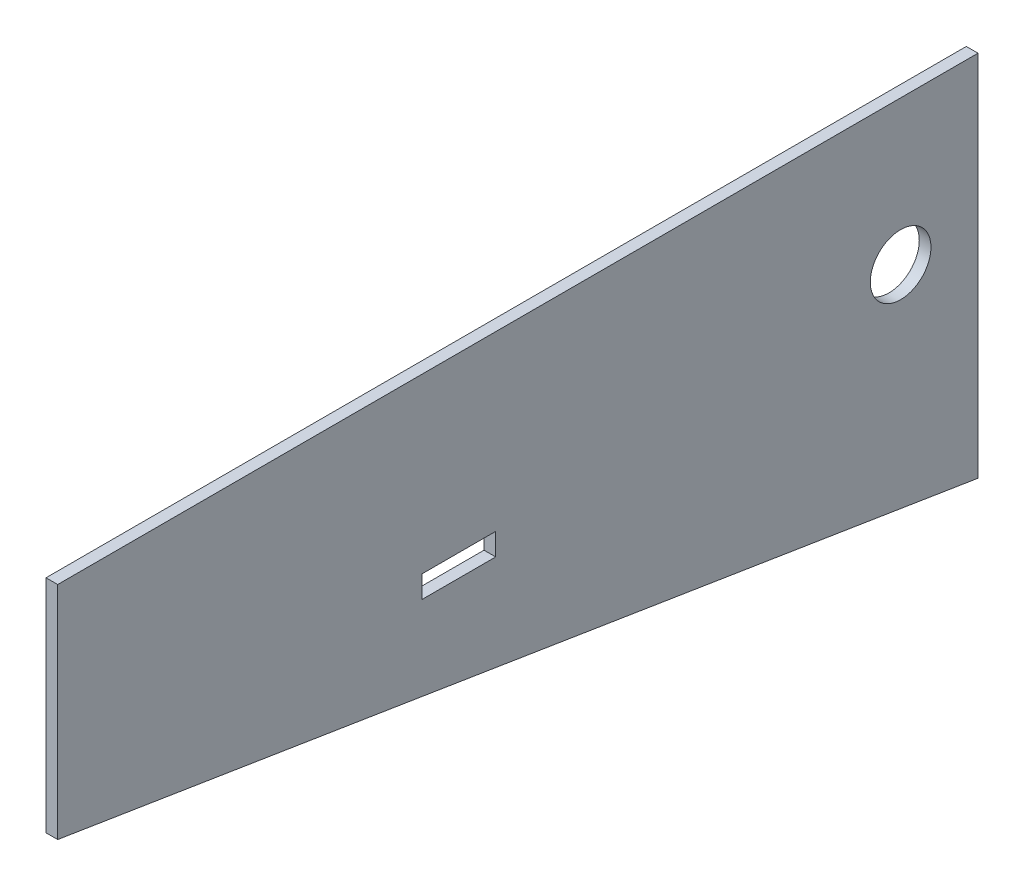
ISO-10303-21;
HEADER;
FILE_DESCRIPTION(('STEP AP214'),'2;1');
FILE_NAME('part.step','',(''),(''),'','','');
FILE_SCHEMA(('AUTOMOTIVE_DESIGN { 1 0 10303 214 1 1 1 1 }'));
ENDSEC;
DATA;
#1=APPLICATION_CONTEXT('core data for automotive mechanical design processes');
#2=APPLICATION_PROTOCOL_DEFINITION('international standard','automotive_design',2000,#1);
#3=PRODUCT_CONTEXT('',#1,'mechanical');
#4=PRODUCT('Part','Part','',(#3));
#5=PRODUCT_RELATED_PRODUCT_CATEGORY('part','',(#4));
#6=PRODUCT_DEFINITION_FORMATION('','',#4);
#7=PRODUCT_DEFINITION_CONTEXT('part definition',#1,'design');
#8=PRODUCT_DEFINITION('design','',#6,#7);
#9=PRODUCT_DEFINITION_SHAPE('','',#8);
#10=(LENGTH_UNIT() NAMED_UNIT(*) SI_UNIT(.MILLI.,.METRE.));
#11=(NAMED_UNIT(*) PLANE_ANGLE_UNIT() SI_UNIT($,.RADIAN.));
#12=(NAMED_UNIT(*) SI_UNIT($,.STERADIAN.) SOLID_ANGLE_UNIT());
#13=UNCERTAINTY_MEASURE_WITH_UNIT(LENGTH_MEASURE(1.E-05),#10,'distance_accuracy_value','');
#14=(GEOMETRIC_REPRESENTATION_CONTEXT(3) GLOBAL_UNCERTAINTY_ASSIGNED_CONTEXT((#13)) GLOBAL_UNIT_ASSIGNED_CONTEXT((#10,
#11,#12)) REPRESENTATION_CONTEXT('',''));
#15=CARTESIAN_POINT('',(0.,0.,0.));
#16=DIRECTION('',(0.,0.,1.));
#17=DIRECTION('',(1.,0.,0.));
#18=AXIS2_PLACEMENT_3D('',#15,#16,#17);
#19=CARTESIAN_POINT('',(1.5875,9.46131753405757,0.));
#20=DIRECTION('',(0.,0.,1.));
#21=DIRECTION('',(1.,0.,0.));
#22=AXIS2_PLACEMENT_3D('',#19,#20,#21);
#23=PLANE('',#22);
#24=DIRECTION('',(0.,1.,0.));
#25=VECTOR('',#24,1.);
#26=CARTESIAN_POINT('',(0.,9.46131753405757,0.));
#27=LINE('',#26,#25);
#28=CARTESIAN_POINT('',(0.,0.,0.));
#29=VERTEX_POINT('',#28);
#30=CARTESIAN_POINT('',(0.,30.,0.));
#31=VERTEX_POINT('',#30);
#32=EDGE_CURVE('E203',#29,#31,#27,.T.);
#33=ORIENTED_EDGE('',*,*,#32,.F.);
#34=DIRECTION('',(-1.,0.,0.));
#35=VECTOR('',#34,1.);
#36=CARTESIAN_POINT('',(1.5875,0.,0.));
#37=LINE('',#36,#35);
#38=CARTESIAN_POINT('',(1.5875,0.,0.));
#39=VERTEX_POINT('',#38);
#40=EDGE_CURVE('E12',#39,#29,#37,.T.);
#41=ORIENTED_EDGE('',*,*,#40,.F.);
#42=DIRECTION('',(0.,1.,0.));
#43=VECTOR('',#42,1.);
#44=CARTESIAN_POINT('',(1.5875,17.8493011645191,0.));
#45=LINE('',#44,#43);
#46=CARTESIAN_POINT('',(1.5875,30.,0.));
#47=VERTEX_POINT('',#46);
#48=EDGE_CURVE('E205',#39,#47,#45,.T.);
#49=ORIENTED_EDGE('',*,*,#48,.T.);
#50=DIRECTION('',(-1.,0.,0.));
#51=VECTOR('',#50,1.);
#52=CARTESIAN_POINT('',(1.5875,30.,0.));
#53=LINE('',#52,#51);
#54=EDGE_CURVE('E52',#47,#31,#53,.T.);
#55=ORIENTED_EDGE('',*,*,#54,.T.);
#56=EDGE_LOOP('',(#33,#41,#49,#55));
#57=FACE_BOUND('',#56,.T.);
#58=ADVANCED_FACE('F48',(#57),#23,.T.);
#59=CARTESIAN_POINT('',(1.5875,-20.,-125.));
#60=DIRECTION('',(0.,-0.987440631916705,0.157990501106673));
#61=DIRECTION('',(0.,-0.157990501106673,-0.987440631916706));
#62=AXIS2_PLACEMENT_3D('',#59,#60,#61);
#63=PLANE('',#62);
#64=DIRECTION('',(0.,0.157990501106673,0.987440631916705));
#65=VECTOR('',#64,1.);
#66=CARTESIAN_POINT('',(0.,-20.,-125.));
#67=LINE('',#66,#65);
#68=CARTESIAN_POINT('',(0.,-20.,-125.));
#69=VERTEX_POINT('',#68);
#70=EDGE_CURVE('E193',#69,#29,#67,.T.);
#71=ORIENTED_EDGE('',*,*,#70,.F.);
#72=DIRECTION('',(-1.,0.,0.));
#73=VECTOR('',#72,1.);
#74=CARTESIAN_POINT('',(1.5875,-20.,-125.));
#75=LINE('',#74,#73);
#76=CARTESIAN_POINT('',(1.5875,-20.,-125.));
#77=VERTEX_POINT('',#76);
#78=EDGE_CURVE('E58',#77,#69,#75,.T.);
#79=ORIENTED_EDGE('',*,*,#78,.F.);
#80=DIRECTION('',(0.,0.157990501106673,0.987440631916705));
#81=VECTOR('',#80,1.);
#82=CARTESIAN_POINT('',(1.5875,-20.,-125.));
#83=LINE('',#82,#81);
#84=EDGE_CURVE('E196',#77,#39,#83,.T.);
#85=ORIENTED_EDGE('',*,*,#84,.T.);
#86=ORIENTED_EDGE('',*,*,#40,.T.);
#87=EDGE_LOOP('',(#71,#79,#85,#86));
#88=FACE_BOUND('',#87,.T.);
#89=ADVANCED_FACE('F245',(#88),#63,.T.);
#90=CARTESIAN_POINT('',(1.5875,30.,-125.));
#91=DIRECTION('',(0.,0.,-1.));
#92=DIRECTION('',(-1.,0.,0.));
#93=AXIS2_PLACEMENT_3D('',#90,#91,#92);
#94=PLANE('',#93);
#95=DIRECTION('',(0.,-1.,0.));
#96=VECTOR('',#95,1.);
#97=CARTESIAN_POINT('',(0.,30.,-125.));
#98=LINE('',#97,#96);
#99=CARTESIAN_POINT('',(0.,30.,-125.));
#100=VERTEX_POINT('',#99);
#101=EDGE_CURVE('E187',#100,#69,#98,.T.);
#102=ORIENTED_EDGE('',*,*,#101,.F.);
#103=DIRECTION('',(-1.,0.,0.));
#104=VECTOR('',#103,1.);
#105=CARTESIAN_POINT('',(1.5875,30.,-125.));
#106=LINE('',#105,#104);
#107=CARTESIAN_POINT('',(1.5875,30.,-125.));
#108=VERTEX_POINT('',#107);
#109=EDGE_CURVE('E208',#108,#100,#106,.T.);
#110=ORIENTED_EDGE('',*,*,#109,.F.);
#111=DIRECTION('',(0.,-1.,0.));
#112=VECTOR('',#111,1.);
#113=CARTESIAN_POINT('',(1.5875,30.,-125.));
#114=LINE('',#113,#112);
#115=EDGE_CURVE('E219',#108,#77,#114,.T.);
#116=ORIENTED_EDGE('',*,*,#115,.T.);
#117=ORIENTED_EDGE('',*,*,#78,.T.);
#118=EDGE_LOOP('',(#102,#110,#116,#117));
#119=FACE_BOUND('',#118,.T.);
#120=ADVANCED_FACE('F246',(#119),#94,.T.);
#121=CARTESIAN_POINT('',(1.5875,30.,0.));
#122=DIRECTION('',(0.,1.,0.));
#123=DIRECTION('',(0.,0.,1.));
#124=AXIS2_PLACEMENT_3D('',#121,#122,#123);
#125=PLANE('',#124);
#126=DIRECTION('',(0.,0.,-1.));
#127=VECTOR('',#126,1.);
#128=CARTESIAN_POINT('',(0.,30.,0.));
#129=LINE('',#128,#127);
#130=EDGE_CURVE('E182',#31,#100,#129,.T.);
#131=ORIENTED_EDGE('',*,*,#130,.F.);
#132=ORIENTED_EDGE('',*,*,#54,.F.);
#133=DIRECTION('',(0.,0.,-1.));
#134=VECTOR('',#133,1.);
#135=CARTESIAN_POINT('',(1.5875,30.,0.));
#136=LINE('',#135,#134);
#137=EDGE_CURVE('E224',#47,#108,#136,.T.);
#138=ORIENTED_EDGE('',*,*,#137,.T.);
#139=ORIENTED_EDGE('',*,*,#109,.T.);
#140=EDGE_LOOP('',(#131,#132,#138,#139));
#141=FACE_BOUND('',#140,.T.);
#142=ADVANCED_FACE('F50',(#141),#125,.T.);
#143=CARTESIAN_POINT('',(1.5875,0.,0.));
#144=DIRECTION('',(-1.,0.,0.));
#145=DIRECTION('',(0.,0.,1.));
#146=AXIS2_PLACEMENT_3D('',#143,#144,#145);
#147=PLANE('',#146);
#148=CARTESIAN_POINT('',(1.5875,10.38,-114.49));
#149=DIRECTION('',(1.,0.,0.));
#150=DIRECTION('',(0.,0.,-1.));
#151=AXIS2_PLACEMENT_3D('',#148,#149,#150);
#152=CIRCLE('',#151,4.11999999999999);
#153=CARTESIAN_POINT('',(1.5875,10.38,-118.61));
#154=VERTEX_POINT('',#153);
#155=EDGE_CURVE('E140',#154,#154,#152,.T.);
#156=ORIENTED_EDGE('',*,*,#155,.F.);
#157=EDGE_LOOP('',(#156));
#158=FACE_BOUND('',#157,.T.);
#159=DIRECTION('',(0.,0.,1.));
#160=VECTOR('',#159,1.);
#161=CARTESIAN_POINT('',(1.5875,6.50999999999998,-49.49));
#162=LINE('',#161,#160);
#163=CARTESIAN_POINT('',(1.5875,6.50999999999998,-59.49));
#164=VERTEX_POINT('',#163);
#165=CARTESIAN_POINT('',(1.5875,6.50999999999998,-49.49));
#166=VERTEX_POINT('',#165);
#167=EDGE_CURVE('E138',#164,#166,#162,.T.);
#168=ORIENTED_EDGE('',*,*,#167,.F.);
#169=DIRECTION('',(0.,1.,0.));
#170=VECTOR('',#169,1.);
#171=CARTESIAN_POINT('',(1.5875,6.50999999999998,-59.49));
#172=LINE('',#171,#170);
#173=CARTESIAN_POINT('',(1.5875,3.49999999999999,-59.49));
#174=VERTEX_POINT('',#173);
#175=EDGE_CURVE('E66',#174,#164,#172,.T.);
#176=ORIENTED_EDGE('',*,*,#175,.F.);
#177=DIRECTION('',(0.,0.,-1.));
#178=VECTOR('',#177,1.);
#179=CARTESIAN_POINT('',(1.5875,3.49999999999999,-49.49));
#180=LINE('',#179,#178);
#181=CARTESIAN_POINT('',(1.5875,3.49999999999999,-49.49));
#182=VERTEX_POINT('',#181);
#183=EDGE_CURVE('E126',#182,#174,#180,.T.);
#184=ORIENTED_EDGE('',*,*,#183,.F.);
#185=DIRECTION('',(0.,-1.,0.));
#186=VECTOR('',#185,1.);
#187=CARTESIAN_POINT('',(1.5875,6.50999999999998,-49.49));
#188=LINE('',#187,#186);
#189=EDGE_CURVE('E132',#166,#182,#188,.T.);
#190=ORIENTED_EDGE('',*,*,#189,.F.);
#191=EDGE_LOOP('',(#168,#176,#184,#190));
#192=FACE_BOUND('',#191,.T.);
#193=ORIENTED_EDGE('',*,*,#48,.F.);
#194=ORIENTED_EDGE('',*,*,#84,.F.);
#195=ORIENTED_EDGE('',*,*,#115,.F.);
#196=ORIENTED_EDGE('',*,*,#137,.F.);
#197=EDGE_LOOP('',(#193,#194,#195,#196));
#198=FACE_BOUND('',#197,.T.);
#199=ADVANCED_FACE('F135',(#158,#192,#198),#147,.F.);
#200=CARTESIAN_POINT('',(0.,0.,0.));
#201=DIRECTION('',(-1.,0.,0.));
#202=DIRECTION('',(0.,0.,1.));
#203=AXIS2_PLACEMENT_3D('',#200,#201,#202);
#204=PLANE('',#203);
#205=CARTESIAN_POINT('',(0.,10.38,-114.49));
#206=DIRECTION('',(1.,0.,0.));
#207=DIRECTION('',(0.,0.,-1.));
#208=AXIS2_PLACEMENT_3D('',#205,#206,#207);
#209=CIRCLE('',#208,4.11999999999999);
#210=CARTESIAN_POINT('',(0.,10.38,-118.61));
#211=VERTEX_POINT('',#210);
#212=EDGE_CURVE('E145',#211,#211,#209,.T.);
#213=ORIENTED_EDGE('',*,*,#212,.T.);
#214=EDGE_LOOP('',(#213));
#215=FACE_BOUND('',#214,.T.);
#216=DIRECTION('',(0.,1.,0.));
#217=VECTOR('',#216,1.);
#218=CARTESIAN_POINT('',(0.,6.50999999999998,-59.49));
#219=LINE('',#218,#217);
#220=CARTESIAN_POINT('',(0.,3.49999999999999,-59.49));
#221=VERTEX_POINT('',#220);
#222=CARTESIAN_POINT('',(0.,6.50999999999998,-59.49));
#223=VERTEX_POINT('',#222);
#224=EDGE_CURVE('E118',#221,#223,#219,.T.);
#225=ORIENTED_EDGE('',*,*,#224,.T.);
#226=DIRECTION('',(0.,0.,1.));
#227=VECTOR('',#226,1.);
#228=CARTESIAN_POINT('',(0.,6.50999999999998,-49.49));
#229=LINE('',#228,#227);
#230=CARTESIAN_POINT('',(0.,6.50999999999998,-49.49));
#231=VERTEX_POINT('',#230);
#232=EDGE_CURVE('E173',#223,#231,#229,.T.);
#233=ORIENTED_EDGE('',*,*,#232,.T.);
#234=DIRECTION('',(0.,-1.,0.));
#235=VECTOR('',#234,1.);
#236=CARTESIAN_POINT('',(0.,6.50999999999998,-49.49));
#237=LINE('',#236,#235);
#238=CARTESIAN_POINT('',(0.,3.49999999999999,-49.49));
#239=VERTEX_POINT('',#238);
#240=EDGE_CURVE('E74',#231,#239,#237,.T.);
#241=ORIENTED_EDGE('',*,*,#240,.T.);
#242=DIRECTION('',(0.,0.,-1.));
#243=VECTOR('',#242,1.);
#244=CARTESIAN_POINT('',(0.,3.49999999999999,-49.49));
#245=LINE('',#244,#243);
#246=EDGE_CURVE('E152',#239,#221,#245,.T.);
#247=ORIENTED_EDGE('',*,*,#246,.T.);
#248=EDGE_LOOP('',(#225,#233,#241,#247));
#249=FACE_BOUND('',#248,.T.);
#250=ORIENTED_EDGE('',*,*,#32,.T.);
#251=ORIENTED_EDGE('',*,*,#130,.T.);
#252=ORIENTED_EDGE('',*,*,#101,.T.);
#253=ORIENTED_EDGE('',*,*,#70,.T.);
#254=EDGE_LOOP('',(#250,#251,#252,#253));
#255=FACE_BOUND('',#254,.T.);
#256=ADVANCED_FACE('F240',(#215,#249,#255),#204,.T.);
#257=CARTESIAN_POINT('',(0.,6.50999999999998,-59.49));
#258=DIRECTION('',(0.,0.,-1.));
#259=DIRECTION('',(-1.,0.,0.));
#260=AXIS2_PLACEMENT_3D('',#257,#258,#259);
#261=PLANE('',#260);
#262=ORIENTED_EDGE('',*,*,#175,.T.);
#263=DIRECTION('',(1.,0.,0.));
#264=VECTOR('',#263,1.);
#265=CARTESIAN_POINT('',(0.,6.50999999999998,-59.49));
#266=LINE('',#265,#264);
#267=EDGE_CURVE('E170',#223,#164,#266,.T.);
#268=ORIENTED_EDGE('',*,*,#267,.F.);
#269=ORIENTED_EDGE('',*,*,#224,.F.);
#270=DIRECTION('',(1.,0.,0.));
#271=VECTOR('',#270,1.);
#272=CARTESIAN_POINT('',(0.,3.49999999999999,-59.49));
#273=LINE('',#272,#271);
#274=EDGE_CURVE('E114',#221,#174,#273,.T.);
#275=ORIENTED_EDGE('',*,*,#274,.T.);
#276=EDGE_LOOP('',(#262,#268,#269,#275));
#277=FACE_BOUND('',#276,.T.);
#278=ADVANCED_FACE('F116',(#277),#261,.F.);
#279=CARTESIAN_POINT('',(0.,3.49999999999999,-49.49));
#280=DIRECTION('',(0.,-1.,0.));
#281=DIRECTION('',(0.,0.,-1.));
#282=AXIS2_PLACEMENT_3D('',#279,#280,#281);
#283=PLANE('',#282);
#284=ORIENTED_EDGE('',*,*,#183,.T.);
#285=ORIENTED_EDGE('',*,*,#274,.F.);
#286=ORIENTED_EDGE('',*,*,#246,.F.);
#287=DIRECTION('',(1.,0.,0.));
#288=VECTOR('',#287,1.);
#289=CARTESIAN_POINT('',(0.,3.49999999999999,-49.49));
#290=LINE('',#289,#288);
#291=EDGE_CURVE('E123',#239,#182,#290,.T.);
#292=ORIENTED_EDGE('',*,*,#291,.T.);
#293=EDGE_LOOP('',(#284,#285,#286,#292));
#294=FACE_BOUND('',#293,.T.);
#295=ADVANCED_FACE('F127',(#294),#283,.F.);
#296=CARTESIAN_POINT('',(0.,6.50999999999998,-49.49));
#297=DIRECTION('',(0.,0.,1.));
#298=DIRECTION('',(1.,0.,0.));
#299=AXIS2_PLACEMENT_3D('',#296,#297,#298);
#300=PLANE('',#299);
#301=ORIENTED_EDGE('',*,*,#189,.T.);
#302=ORIENTED_EDGE('',*,*,#291,.F.);
#303=ORIENTED_EDGE('',*,*,#240,.F.);
#304=DIRECTION('',(1.,0.,0.));
#305=VECTOR('',#304,1.);
#306=CARTESIAN_POINT('',(0.,6.50999999999998,-49.49));
#307=LINE('',#306,#305);
#308=EDGE_CURVE('E165',#231,#166,#307,.T.);
#309=ORIENTED_EDGE('',*,*,#308,.T.);
#310=EDGE_LOOP('',(#301,#302,#303,#309));
#311=FACE_BOUND('',#310,.T.);
#312=ADVANCED_FACE('F164',(#311),#300,.F.);
#313=CARTESIAN_POINT('',(0.,6.50999999999998,-49.49));
#314=DIRECTION('',(0.,1.,0.));
#315=DIRECTION('',(0.,0.,1.));
#316=AXIS2_PLACEMENT_3D('',#313,#314,#315);
#317=PLANE('',#316);
#318=ORIENTED_EDGE('',*,*,#167,.T.);
#319=ORIENTED_EDGE('',*,*,#308,.F.);
#320=ORIENTED_EDGE('',*,*,#232,.F.);
#321=ORIENTED_EDGE('',*,*,#267,.T.);
#322=EDGE_LOOP('',(#318,#319,#320,#321));
#323=FACE_BOUND('',#322,.T.);
#324=ADVANCED_FACE('F172',(#323),#317,.F.);
#325=CARTESIAN_POINT('',(0.,10.38,-114.49));
#326=DIRECTION('',(1.,0.,0.));
#327=DIRECTION('',(0.,0.,-1.));
#328=AXIS2_PLACEMENT_3D('',#325,#326,#327);
#329=CYLINDRICAL_SURFACE('',#328,4.11999999999999);
#330=ORIENTED_EDGE('',*,*,#212,.F.);
#331=EDGE_LOOP('',(#330));
#332=FACE_BOUND('',#331,.T.);
#333=ORIENTED_EDGE('',*,*,#155,.T.);
#334=EDGE_LOOP('',(#333));
#335=FACE_BOUND('',#334,.T.);
#336=ADVANCED_FACE('F268',(#332,#335),#329,.F.);
#337=CLOSED_SHELL('',(#58,#89,#120,#142,#199,#256,#278,#295,#312,#324,#336));
#338=MANIFOLD_SOLID_BREP('B2',#337);
#339=ADVANCED_BREP_SHAPE_REPRESENTATION('',(#18,#338),#14);
#340=SHAPE_DEFINITION_REPRESENTATION(#9,#339);
ENDSEC;
END-ISO-10303-21;
